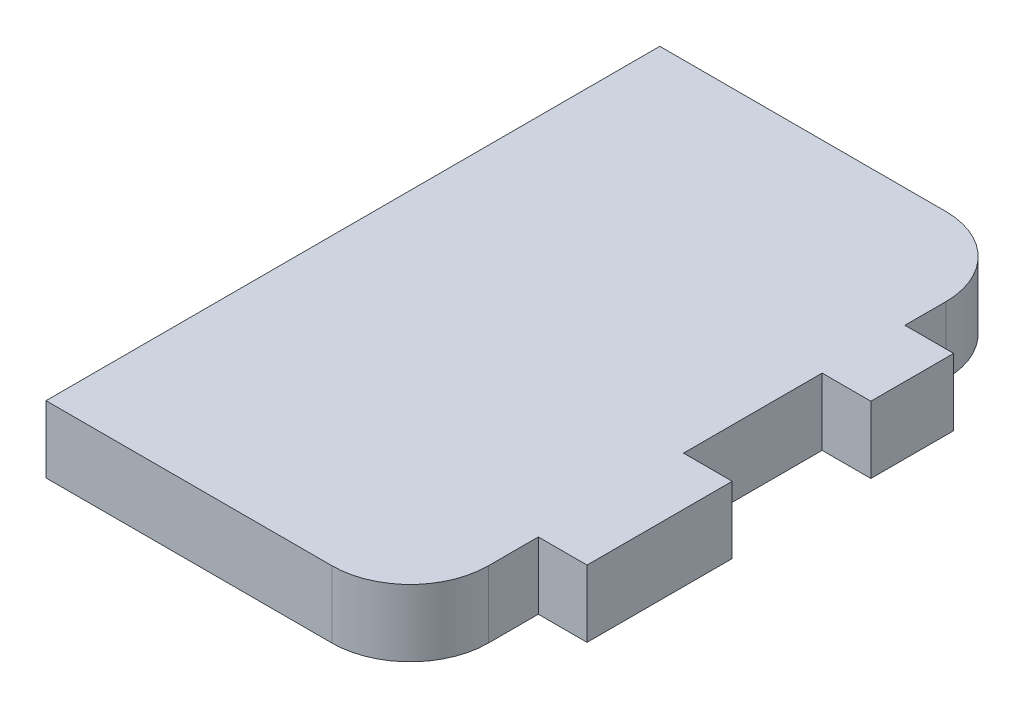
ISO-10303-21;
HEADER;
FILE_DESCRIPTION(('STEP AP214'),'2;1');
FILE_NAME('part.step','',(''),(''),'','','');
FILE_SCHEMA(('AUTOMOTIVE_DESIGN { 1 0 10303 214 1 1 1 1 }'));
ENDSEC;
DATA;
#1=APPLICATION_CONTEXT('core data for automotive mechanical design processes');
#2=APPLICATION_PROTOCOL_DEFINITION('international standard','automotive_design',2000,#1);
#3=PRODUCT_CONTEXT('',#1,'mechanical');
#4=PRODUCT('Part','Part','',(#3));
#5=PRODUCT_RELATED_PRODUCT_CATEGORY('part','',(#4));
#6=PRODUCT_DEFINITION_FORMATION('','',#4);
#7=PRODUCT_DEFINITION_CONTEXT('part definition',#1,'design');
#8=PRODUCT_DEFINITION('design','',#6,#7);
#9=PRODUCT_DEFINITION_SHAPE('','',#8);
#10=(LENGTH_UNIT() NAMED_UNIT(*) SI_UNIT(.MILLI.,.METRE.));
#11=(NAMED_UNIT(*) PLANE_ANGLE_UNIT() SI_UNIT($,.RADIAN.));
#12=(NAMED_UNIT(*) SI_UNIT($,.STERADIAN.) SOLID_ANGLE_UNIT());
#13=UNCERTAINTY_MEASURE_WITH_UNIT(LENGTH_MEASURE(1.E-05),#10,'distance_accuracy_value','');
#14=(GEOMETRIC_REPRESENTATION_CONTEXT(3) GLOBAL_UNCERTAINTY_ASSIGNED_CONTEXT((#13)) GLOBAL_UNIT_ASSIGNED_CONTEXT((#10,
#11,#12)) REPRESENTATION_CONTEXT('',''));
#15=CARTESIAN_POINT('',(0.,0.,0.));
#16=DIRECTION('',(0.,0.,1.));
#17=DIRECTION('',(1.,0.,0.));
#18=AXIS2_PLACEMENT_3D('',#15,#16,#17);
#19=CARTESIAN_POINT('',(37.,6.,0.));
#20=DIRECTION('',(-1.,0.,0.));
#21=DIRECTION('',(0.,0.,1.));
#22=AXIS2_PLACEMENT_3D('',#19,#20,#21);
#23=PLANE('',#22);
#24=DIRECTION('',(0.,0.,-1.));
#25=VECTOR('',#24,1.);
#26=CARTESIAN_POINT('',(37.,0.,0.));
#27=LINE('',#26,#25);
#28=CARTESIAN_POINT('',(37.,0.,-11.4833984498874));
#29=VERTEX_POINT('',#28);
#30=CARTESIAN_POINT('',(37.,0.,-24.4926391684315));
#31=VERTEX_POINT('',#30);
#32=EDGE_CURVE('E161',#29,#31,#27,.T.);
#33=ORIENTED_EDGE('',*,*,#32,.T.);
#34=DIRECTION('',(0.,1.,0.));
#35=VECTOR('',#34,1.);
#36=CARTESIAN_POINT('',(37.,0.,-24.4926391684315));
#37=LINE('',#36,#35);
#38=CARTESIAN_POINT('',(37.,6.,-24.4926391684315));
#39=VERTEX_POINT('',#38);
#40=EDGE_CURVE('E207',#31,#39,#37,.T.);
#41=ORIENTED_EDGE('',*,*,#40,.T.);
#42=DIRECTION('',(0.,0.,-1.));
#43=VECTOR('',#42,1.);
#44=CARTESIAN_POINT('',(37.,6.,0.));
#45=LINE('',#44,#43);
#46=CARTESIAN_POINT('',(37.,6.,-11.4833984498874));
#47=VERTEX_POINT('',#46);
#48=EDGE_CURVE('E225',#47,#39,#45,.T.);
#49=ORIENTED_EDGE('',*,*,#48,.F.);
#50=DIRECTION('',(0.,1.,0.));
#51=VECTOR('',#50,1.);
#52=CARTESIAN_POINT('',(37.,0.,-11.4833984498874));
#53=LINE('',#52,#51);
#54=EDGE_CURVE('E285',#29,#47,#53,.T.);
#55=ORIENTED_EDGE('',*,*,#54,.F.);
#56=EDGE_LOOP('',(#33,#41,#49,#55));
#57=FACE_BOUND('',#56,.T.);
#58=ADVANCED_FACE('F35',(#57),#23,.F.);
#59=CARTESIAN_POINT('',(0.,6.,0.));
#60=DIRECTION('',(1.,0.,0.));
#61=DIRECTION('',(0.,0.,-1.));
#62=AXIS2_PLACEMENT_3D('',#59,#60,#61);
#63=PLANE('',#62);
#64=DIRECTION('',(0.,0.,1.));
#65=VECTOR('',#64,1.);
#66=CARTESIAN_POINT('',(0.,0.,0.));
#67=LINE('',#66,#65);
#68=CARTESIAN_POINT('',(0.,0.,-55.));
#69=VERTEX_POINT('',#68);
#70=CARTESIAN_POINT('',(0.,0.,0.));
#71=VERTEX_POINT('',#70);
#72=EDGE_CURVE('E167',#69,#71,#67,.T.);
#73=ORIENTED_EDGE('',*,*,#72,.T.);
#74=DIRECTION('',(0.,-1.,0.));
#75=VECTOR('',#74,1.);
#76=CARTESIAN_POINT('',(0.,6.,0.));
#77=LINE('',#76,#75);
#78=CARTESIAN_POINT('',(0.,6.,0.));
#79=VERTEX_POINT('',#78);
#80=EDGE_CURVE('E176',#79,#71,#77,.T.);
#81=ORIENTED_EDGE('',*,*,#80,.F.);
#82=DIRECTION('',(0.,0.,1.));
#83=VECTOR('',#82,1.);
#84=CARTESIAN_POINT('',(0.,6.,0.));
#85=LINE('',#84,#83);
#86=CARTESIAN_POINT('',(0.,6.,-55.));
#87=VERTEX_POINT('',#86);
#88=EDGE_CURVE('E172',#87,#79,#85,.T.);
#89=ORIENTED_EDGE('',*,*,#88,.F.);
#90=DIRECTION('',(0.,-1.,0.));
#91=VECTOR('',#90,1.);
#92=CARTESIAN_POINT('',(0.,6.,-55.));
#93=LINE('',#92,#91);
#94=EDGE_CURVE('E173',#87,#69,#93,.T.);
#95=ORIENTED_EDGE('',*,*,#94,.T.);
#96=EDGE_LOOP('',(#73,#81,#89,#95));
#97=FACE_BOUND('',#96,.T.);
#98=ADVANCED_FACE('F230',(#97),#63,.F.);
#99=CARTESIAN_POINT('',(0.,6.,0.));
#100=DIRECTION('',(0.,0.,-1.));
#101=DIRECTION('',(-1.,0.,0.));
#102=AXIS2_PLACEMENT_3D('',#99,#100,#101);
#103=PLANE('',#102);
#104=DIRECTION('',(1.,0.,0.));
#105=VECTOR('',#104,1.);
#106=CARTESIAN_POINT('',(0.,0.,0.));
#107=LINE('',#106,#105);
#108=CARTESIAN_POINT('',(25.6339921703758,0.,0.));
#109=VERTEX_POINT('',#108);
#110=EDGE_CURVE('E162',#71,#109,#107,.T.);
#111=ORIENTED_EDGE('',*,*,#110,.T.);
#112=DIRECTION('',(0.,1.,0.));
#113=VECTOR('',#112,1.);
#114=CARTESIAN_POINT('',(25.6339921703758,6.,0.));
#115=LINE('',#114,#113);
#116=CARTESIAN_POINT('',(25.6339921703758,6.,0.));
#117=VERTEX_POINT('',#116);
#118=EDGE_CURVE('E180',#109,#117,#115,.T.);
#119=ORIENTED_EDGE('',*,*,#118,.T.);
#120=DIRECTION('',(1.,0.,0.));
#121=VECTOR('',#120,1.);
#122=CARTESIAN_POINT('',(0.,6.,0.));
#123=LINE('',#122,#121);
#124=EDGE_CURVE('E222',#79,#117,#123,.T.);
#125=ORIENTED_EDGE('',*,*,#124,.F.);
#126=ORIENTED_EDGE('',*,*,#80,.T.);
#127=EDGE_LOOP('',(#111,#119,#125,#126));
#128=FACE_BOUND('',#127,.T.);
#129=ADVANCED_FACE('F236',(#128),#103,.F.);
#130=CARTESIAN_POINT('',(37.,6.,-36.9151595613202));
#131=VERTEX_POINT('',#130);
#132=CARTESIAN_POINT('',(37.,6.,-44.332861789667));
#133=VERTEX_POINT('',#132);
#134=EDGE_CURVE('E153',#131,#133,#45,.T.);
#135=ORIENTED_EDGE('',*,*,#134,.F.);
#136=DIRECTION('',(0.,1.,0.));
#137=VECTOR('',#136,1.);
#138=CARTESIAN_POINT('',(37.,0.,-36.9151595613202));
#139=LINE('',#138,#137);
#140=CARTESIAN_POINT('',(37.,0.,-36.9151595613202));
#141=VERTEX_POINT('',#140);
#142=EDGE_CURVE('E139',#141,#131,#139,.T.);
#143=ORIENTED_EDGE('',*,*,#142,.F.);
#144=CARTESIAN_POINT('',(37.,0.,-44.332861789667));
#145=VERTEX_POINT('',#144);
#146=EDGE_CURVE('E151',#141,#145,#27,.T.);
#147=ORIENTED_EDGE('',*,*,#146,.T.);
#148=DIRECTION('',(0.,1.,0.));
#149=VECTOR('',#148,1.);
#150=CARTESIAN_POINT('',(37.,0.,-44.332861789667));
#151=LINE('',#150,#149);
#152=EDGE_CURVE('E216',#145,#133,#151,.T.);
#153=ORIENTED_EDGE('',*,*,#152,.T.);
#154=EDGE_LOOP('',(#135,#143,#147,#153));
#155=FACE_BOUND('',#154,.T.);
#156=ADVANCED_FACE('F149',(#155),#23,.F.);
#157=CARTESIAN_POINT('',(0.,6.,-55.));
#158=DIRECTION('',(0.,0.,1.));
#159=DIRECTION('',(1.,0.,0.));
#160=AXIS2_PLACEMENT_3D('',#157,#158,#159);
#161=PLANE('',#160);
#162=DIRECTION('',(-1.,0.,0.));
#163=VECTOR('',#162,1.);
#164=CARTESIAN_POINT('',(0.,6.,-55.));
#165=LINE('',#164,#163);
#166=CARTESIAN_POINT('',(25.6339921703758,6.,-55.));
#167=VERTEX_POINT('',#166);
#168=EDGE_CURVE('E177',#167,#87,#165,.T.);
#169=ORIENTED_EDGE('',*,*,#168,.F.);
#170=DIRECTION('',(0.,1.,0.));
#171=VECTOR('',#170,1.);
#172=CARTESIAN_POINT('',(25.6339921703758,6.,-55.));
#173=LINE('',#172,#171);
#174=CARTESIAN_POINT('',(25.6339921703758,0.,-55.));
#175=VERTEX_POINT('',#174);
#176=EDGE_CURVE('E11',#167,#175,#173,.F.);
#177=ORIENTED_EDGE('',*,*,#176,.T.);
#178=DIRECTION('',(-1.,0.,0.));
#179=VECTOR('',#178,1.);
#180=CARTESIAN_POINT('',(0.,0.,-55.));
#181=LINE('',#180,#179);
#182=EDGE_CURVE('E165',#175,#69,#181,.T.);
#183=ORIENTED_EDGE('',*,*,#182,.T.);
#184=ORIENTED_EDGE('',*,*,#94,.F.);
#185=EDGE_LOOP('',(#169,#177,#183,#184));
#186=FACE_BOUND('',#185,.T.);
#187=ADVANCED_FACE('F237',(#186),#161,.F.);
#188=CARTESIAN_POINT('',(0.,6.,0.));
#189=DIRECTION('',(0.,-1.,0.));
#190=DIRECTION('',(0.,0.,-1.));
#191=AXIS2_PLACEMENT_3D('',#188,#189,#190);
#192=PLANE('',#191);
#193=ORIENTED_EDGE('',*,*,#124,.T.);
#194=CARTESIAN_POINT('',(25.6339921703758,6.,-7.));
#195=DIRECTION('',(0.,-1.,0.));
#196=DIRECTION('',(0.,0.,-1.));
#197=AXIS2_PLACEMENT_3D('',#194,#195,#196);
#198=CIRCLE('',#197,7.);
#199=CARTESIAN_POINT('',(32.6339921703758,6.,-7.));
#200=VERTEX_POINT('',#199);
#201=EDGE_CURVE('E185',#117,#200,#198,.F.);
#202=ORIENTED_EDGE('',*,*,#201,.T.);
#203=DIRECTION('',(0.,0.,1.));
#204=VECTOR('',#203,1.);
#205=CARTESIAN_POINT('',(32.6339921703758,6.,-11.4833984498874));
#206=LINE('',#205,#204);
#207=CARTESIAN_POINT('',(32.6339921703758,6.,-11.4833984498874));
#208=VERTEX_POINT('',#207);
#209=EDGE_CURVE('E268',#208,#200,#206,.T.);
#210=ORIENTED_EDGE('',*,*,#209,.F.);
#211=DIRECTION('',(-1.,0.,0.));
#212=VECTOR('',#211,1.);
#213=CARTESIAN_POINT('',(37.,6.,-11.4833984498874));
#214=LINE('',#213,#212);
#215=EDGE_CURVE('E275',#47,#208,#214,.T.);
#216=ORIENTED_EDGE('',*,*,#215,.F.);
#217=ORIENTED_EDGE('',*,*,#48,.T.);
#218=DIRECTION('',(1.,0.,0.));
#219=VECTOR('',#218,1.);
#220=CARTESIAN_POINT('',(37.,6.,-24.4926391684315));
#221=LINE('',#220,#219);
#222=CARTESIAN_POINT('',(32.6339921703758,6.,-24.4926391684315));
#223=VERTEX_POINT('',#222);
#224=EDGE_CURVE('E145',#223,#39,#221,.T.);
#225=ORIENTED_EDGE('',*,*,#224,.F.);
#226=DIRECTION('',(0.,0.,1.));
#227=VECTOR('',#226,1.);
#228=CARTESIAN_POINT('',(32.6339921703758,6.,-36.9151595613202));
#229=LINE('',#228,#227);
#230=CARTESIAN_POINT('',(32.6339921703758,6.,-36.9151595613202));
#231=VERTEX_POINT('',#230);
#232=EDGE_CURVE('E316',#231,#223,#229,.T.);
#233=ORIENTED_EDGE('',*,*,#232,.F.);
#234=DIRECTION('',(-1.,0.,0.));
#235=VECTOR('',#234,1.);
#236=CARTESIAN_POINT('',(37.,6.,-36.9151595613202));
#237=LINE('',#236,#235);
#238=EDGE_CURVE('E284',#131,#231,#237,.T.);
#239=ORIENTED_EDGE('',*,*,#238,.F.);
#240=ORIENTED_EDGE('',*,*,#134,.T.);
#241=DIRECTION('',(1.,0.,0.));
#242=VECTOR('',#241,1.);
#243=CARTESIAN_POINT('',(37.,6.,-44.332861789667));
#244=LINE('',#243,#242);
#245=CARTESIAN_POINT('',(32.6339921703758,6.,-44.332861789667));
#246=VERTEX_POINT('',#245);
#247=EDGE_CURVE('E206',#246,#133,#244,.T.);
#248=ORIENTED_EDGE('',*,*,#247,.F.);
#249=DIRECTION('',(0.,0.,1.));
#250=VECTOR('',#249,1.);
#251=CARTESIAN_POINT('',(32.6339921703758,6.,-44.332861789667));
#252=LINE('',#251,#250);
#253=CARTESIAN_POINT('',(32.6339921703758,6.,-48.));
#254=VERTEX_POINT('',#253);
#255=EDGE_CURVE('E197',#254,#246,#252,.T.);
#256=ORIENTED_EDGE('',*,*,#255,.F.);
#257=CARTESIAN_POINT('',(25.6339921703758,6.,-48.));
#258=DIRECTION('',(0.,-1.,0.));
#259=DIRECTION('',(0.,0.,-1.));
#260=AXIS2_PLACEMENT_3D('',#257,#258,#259);
#261=CIRCLE('',#260,7.);
#262=EDGE_CURVE('E183',#254,#167,#261,.F.);
#263=ORIENTED_EDGE('',*,*,#262,.T.);
#264=ORIENTED_EDGE('',*,*,#168,.T.);
#265=ORIENTED_EDGE('',*,*,#88,.T.);
#266=EDGE_LOOP('',(#193,#202,#210,#216,#217,#225,#233,#239,#240,#248,#256,#263,#264,#265));
#267=FACE_BOUND('',#266,.T.);
#268=ADVANCED_FACE('F204',(#267),#192,.F.);
#269=CARTESIAN_POINT('',(0.,0.,0.));
#270=DIRECTION('',(0.,-1.,0.));
#271=DIRECTION('',(0.,0.,-1.));
#272=AXIS2_PLACEMENT_3D('',#269,#270,#271);
#273=PLANE('',#272);
#274=DIRECTION('',(0.,0.,1.));
#275=VECTOR('',#274,1.);
#276=CARTESIAN_POINT('',(32.6339921703758,0.,-11.4833984498874));
#277=LINE('',#276,#275);
#278=CARTESIAN_POINT('',(32.6339921703758,0.,-11.4833984498874));
#279=VERTEX_POINT('',#278);
#280=CARTESIAN_POINT('',(32.6339921703758,0.,-7.));
#281=VERTEX_POINT('',#280);
#282=EDGE_CURVE('E278',#279,#281,#277,.T.);
#283=ORIENTED_EDGE('',*,*,#282,.T.);
#284=CARTESIAN_POINT('',(25.6339921703758,0.,-7.));
#285=DIRECTION('',(0.,-1.,0.));
#286=DIRECTION('',(0.,0.,-1.));
#287=AXIS2_PLACEMENT_3D('',#284,#285,#286);
#288=CIRCLE('',#287,7.);
#289=EDGE_CURVE('E190',#281,#109,#288,.T.);
#290=ORIENTED_EDGE('',*,*,#289,.T.);
#291=ORIENTED_EDGE('',*,*,#110,.F.);
#292=ORIENTED_EDGE('',*,*,#72,.F.);
#293=ORIENTED_EDGE('',*,*,#182,.F.);
#294=CARTESIAN_POINT('',(25.6339921703758,0.,-48.));
#295=DIRECTION('',(0.,-1.,0.));
#296=DIRECTION('',(0.,0.,-1.));
#297=AXIS2_PLACEMENT_3D('',#294,#295,#296);
#298=CIRCLE('',#297,7.);
#299=CARTESIAN_POINT('',(32.6339921703758,0.,-48.));
#300=VERTEX_POINT('',#299);
#301=EDGE_CURVE('E50',#175,#300,#298,.T.);
#302=ORIENTED_EDGE('',*,*,#301,.T.);
#303=DIRECTION('',(0.,0.,1.));
#304=VECTOR('',#303,1.);
#305=CARTESIAN_POINT('',(32.6339921703758,0.,-44.332861789667));
#306=LINE('',#305,#304);
#307=CARTESIAN_POINT('',(32.6339921703758,0.,-44.332861789667));
#308=VERTEX_POINT('',#307);
#309=EDGE_CURVE('E199',#300,#308,#306,.T.);
#310=ORIENTED_EDGE('',*,*,#309,.T.);
#311=DIRECTION('',(1.,0.,0.));
#312=VECTOR('',#311,1.);
#313=CARTESIAN_POINT('',(37.,0.,-44.332861789667));
#314=LINE('',#313,#312);
#315=EDGE_CURVE('E160',#308,#145,#314,.T.);
#316=ORIENTED_EDGE('',*,*,#315,.T.);
#317=ORIENTED_EDGE('',*,*,#146,.F.);
#318=DIRECTION('',(-1.,0.,0.));
#319=VECTOR('',#318,1.);
#320=CARTESIAN_POINT('',(37.,0.,-36.9151595613202));
#321=LINE('',#320,#319);
#322=CARTESIAN_POINT('',(32.6339921703758,0.,-36.9151595613202));
#323=VERTEX_POINT('',#322);
#324=EDGE_CURVE('E135',#141,#323,#321,.T.);
#325=ORIENTED_EDGE('',*,*,#324,.T.);
#326=DIRECTION('',(0.,0.,1.));
#327=VECTOR('',#326,1.);
#328=CARTESIAN_POINT('',(32.6339921703758,0.,-36.9151595613202));
#329=LINE('',#328,#327);
#330=CARTESIAN_POINT('',(32.6339921703758,0.,-24.4926391684315));
#331=VERTEX_POINT('',#330);
#332=EDGE_CURVE('E144',#323,#331,#329,.T.);
#333=ORIENTED_EDGE('',*,*,#332,.T.);
#334=DIRECTION('',(1.,0.,0.));
#335=VECTOR('',#334,1.);
#336=CARTESIAN_POINT('',(37.,0.,-24.4926391684315));
#337=LINE('',#336,#335);
#338=EDGE_CURVE('E154',#331,#31,#337,.T.);
#339=ORIENTED_EDGE('',*,*,#338,.T.);
#340=ORIENTED_EDGE('',*,*,#32,.F.);
#341=DIRECTION('',(-1.,0.,0.));
#342=VECTOR('',#341,1.);
#343=CARTESIAN_POINT('',(37.,0.,-11.4833984498874));
#344=LINE('',#343,#342);
#345=EDGE_CURVE('E274',#29,#279,#344,.T.);
#346=ORIENTED_EDGE('',*,*,#345,.T.);
#347=EDGE_LOOP('',(#283,#290,#291,#292,#293,#302,#310,#316,#317,#325,#333,#339,#340,#346));
#348=FACE_BOUND('',#347,.T.);
#349=ADVANCED_FACE('F158',(#348),#273,.T.);
#350=CARTESIAN_POINT('',(37.,0.,-44.332861789667));
#351=DIRECTION('',(0.,0.,1.));
#352=DIRECTION('',(1.,0.,0.));
#353=AXIS2_PLACEMENT_3D('',#350,#351,#352);
#354=PLANE('',#353);
#355=ORIENTED_EDGE('',*,*,#247,.T.);
#356=ORIENTED_EDGE('',*,*,#152,.F.);
#357=ORIENTED_EDGE('',*,*,#315,.F.);
#358=DIRECTION('',(0.,1.,0.));
#359=VECTOR('',#358,1.);
#360=CARTESIAN_POINT('',(32.6339921703758,0.,-44.332861789667));
#361=LINE('',#360,#359);
#362=EDGE_CURVE('E218',#308,#246,#361,.T.);
#363=ORIENTED_EDGE('',*,*,#362,.T.);
#364=EDGE_LOOP('',(#355,#356,#357,#363));
#365=FACE_BOUND('',#364,.T.);
#366=ADVANCED_FACE('F287',(#365),#354,.F.);
#367=CARTESIAN_POINT('',(32.6339921703758,0.,-44.332861789667));
#368=DIRECTION('',(-1.,0.,0.));
#369=DIRECTION('',(0.,0.,1.));
#370=AXIS2_PLACEMENT_3D('',#367,#368,#369);
#371=PLANE('',#370);
#372=ORIENTED_EDGE('',*,*,#309,.F.);
#373=DIRECTION('',(0.,1.,0.));
#374=VECTOR('',#373,1.);
#375=CARTESIAN_POINT('',(32.6339921703758,0.,-48.));
#376=LINE('',#375,#374);
#377=EDGE_CURVE('E43',#300,#254,#376,.T.);
#378=ORIENTED_EDGE('',*,*,#377,.T.);
#379=ORIENTED_EDGE('',*,*,#255,.T.);
#380=ORIENTED_EDGE('',*,*,#362,.F.);
#381=EDGE_LOOP('',(#372,#378,#379,#380));
#382=FACE_BOUND('',#381,.T.);
#383=ADVANCED_FACE('F195',(#382),#371,.F.);
#384=CARTESIAN_POINT('',(32.6339921703758,0.,-11.4833984498874));
#385=DIRECTION('',(-1.,0.,0.));
#386=DIRECTION('',(0.,0.,1.));
#387=AXIS2_PLACEMENT_3D('',#384,#385,#386);
#388=PLANE('',#387);
#389=ORIENTED_EDGE('',*,*,#209,.T.);
#390=DIRECTION('',(0.,1.,0.));
#391=VECTOR('',#390,1.);
#392=CARTESIAN_POINT('',(32.6339921703758,0.,-7.));
#393=LINE('',#392,#391);
#394=EDGE_CURVE('E187',#200,#281,#393,.F.);
#395=ORIENTED_EDGE('',*,*,#394,.T.);
#396=ORIENTED_EDGE('',*,*,#282,.F.);
#397=DIRECTION('',(0.,1.,0.));
#398=VECTOR('',#397,1.);
#399=CARTESIAN_POINT('',(32.6339921703758,0.,-11.4833984498874));
#400=LINE('',#399,#398);
#401=EDGE_CURVE('E272',#279,#208,#400,.T.);
#402=ORIENTED_EDGE('',*,*,#401,.T.);
#403=EDGE_LOOP('',(#389,#395,#396,#402));
#404=FACE_BOUND('',#403,.T.);
#405=ADVANCED_FACE('F270',(#404),#388,.F.);
#406=CARTESIAN_POINT('',(37.,0.,-11.4833984498874));
#407=DIRECTION('',(0.,0.,-1.));
#408=DIRECTION('',(-1.,0.,0.));
#409=AXIS2_PLACEMENT_3D('',#406,#407,#408);
#410=PLANE('',#409);
#411=ORIENTED_EDGE('',*,*,#215,.T.);
#412=ORIENTED_EDGE('',*,*,#401,.F.);
#413=ORIENTED_EDGE('',*,*,#345,.F.);
#414=ORIENTED_EDGE('',*,*,#54,.T.);
#415=EDGE_LOOP('',(#411,#412,#413,#414));
#416=FACE_BOUND('',#415,.T.);
#417=ADVANCED_FACE('F296',(#416),#410,.F.);
#418=CARTESIAN_POINT('',(37.,0.,-24.4926391684315));
#419=DIRECTION('',(0.,0.,1.));
#420=DIRECTION('',(1.,0.,0.));
#421=AXIS2_PLACEMENT_3D('',#418,#419,#420);
#422=PLANE('',#421);
#423=ORIENTED_EDGE('',*,*,#224,.T.);
#424=ORIENTED_EDGE('',*,*,#40,.F.);
#425=ORIENTED_EDGE('',*,*,#338,.F.);
#426=DIRECTION('',(0.,1.,0.));
#427=VECTOR('',#426,1.);
#428=CARTESIAN_POINT('',(32.6339921703758,0.,-24.4926391684315));
#429=LINE('',#428,#427);
#430=EDGE_CURVE('E211',#331,#223,#429,.T.);
#431=ORIENTED_EDGE('',*,*,#430,.T.);
#432=EDGE_LOOP('',(#423,#424,#425,#431));
#433=FACE_BOUND('',#432,.T.);
#434=ADVANCED_FACE('F299',(#433),#422,.F.);
#435=CARTESIAN_POINT('',(32.6339921703758,0.,-36.9151595613202));
#436=DIRECTION('',(-1.,0.,0.));
#437=DIRECTION('',(0.,0.,1.));
#438=AXIS2_PLACEMENT_3D('',#435,#436,#437);
#439=PLANE('',#438);
#440=ORIENTED_EDGE('',*,*,#232,.T.);
#441=ORIENTED_EDGE('',*,*,#430,.F.);
#442=ORIENTED_EDGE('',*,*,#332,.F.);
#443=DIRECTION('',(0.,1.,0.));
#444=VECTOR('',#443,1.);
#445=CARTESIAN_POINT('',(32.6339921703758,0.,-36.9151595613202));
#446=LINE('',#445,#444);
#447=EDGE_CURVE('E141',#323,#231,#446,.T.);
#448=ORIENTED_EDGE('',*,*,#447,.T.);
#449=EDGE_LOOP('',(#440,#441,#442,#448));
#450=FACE_BOUND('',#449,.T.);
#451=ADVANCED_FACE('F262',(#450),#439,.F.);
#452=CARTESIAN_POINT('',(37.,0.,-36.9151595613202));
#453=DIRECTION('',(0.,0.,-1.));
#454=DIRECTION('',(-1.,0.,0.));
#455=AXIS2_PLACEMENT_3D('',#452,#453,#454);
#456=PLANE('',#455);
#457=ORIENTED_EDGE('',*,*,#238,.T.);
#458=ORIENTED_EDGE('',*,*,#447,.F.);
#459=ORIENTED_EDGE('',*,*,#324,.F.);
#460=ORIENTED_EDGE('',*,*,#142,.T.);
#461=EDGE_LOOP('',(#457,#458,#459,#460));
#462=FACE_BOUND('',#461,.T.);
#463=ADVANCED_FACE('F138',(#462),#456,.F.);
#464=CARTESIAN_POINT('',(25.6339921703758,6.,-7.));
#465=DIRECTION('',(0.,1.,0.));
#466=DIRECTION('',(0.,0.,1.));
#467=AXIS2_PLACEMENT_3D('',#464,#465,#466);
#468=CYLINDRICAL_SURFACE('',#467,7.);
#469=ORIENTED_EDGE('',*,*,#289,.F.);
#470=ORIENTED_EDGE('',*,*,#394,.F.);
#471=ORIENTED_EDGE('',*,*,#201,.F.);
#472=ORIENTED_EDGE('',*,*,#118,.F.);
#473=EDGE_LOOP('',(#469,#470,#471,#472));
#474=FACE_BOUND('',#473,.T.);
#475=ADVANCED_FACE('F255',(#474),#468,.T.);
#476=CARTESIAN_POINT('',(25.6339921703758,0.,-48.));
#477=DIRECTION('',(0.,1.,0.));
#478=DIRECTION('',(0.,0.,1.));
#479=AXIS2_PLACEMENT_3D('',#476,#477,#478);
#480=CYLINDRICAL_SURFACE('',#479,7.);
#481=ORIENTED_EDGE('',*,*,#301,.F.);
#482=ORIENTED_EDGE('',*,*,#176,.F.);
#483=ORIENTED_EDGE('',*,*,#262,.F.);
#484=ORIENTED_EDGE('',*,*,#377,.F.);
#485=EDGE_LOOP('',(#481,#482,#483,#484));
#486=FACE_BOUND('',#485,.T.);
#487=ADVANCED_FACE('F37',(#486),#480,.T.);
#488=CLOSED_SHELL('',(#58,#98,#129,#156,#187,#268,#349,#366,#383,#405,#417,#434,#451,#463,#475,#487));
#489=MANIFOLD_SOLID_BREP('B2',#488);
#490=ADVANCED_BREP_SHAPE_REPRESENTATION('',(#18,#489),#14);
#491=SHAPE_DEFINITION_REPRESENTATION(#9,#490);
ENDSEC;
END-ISO-10303-21;
